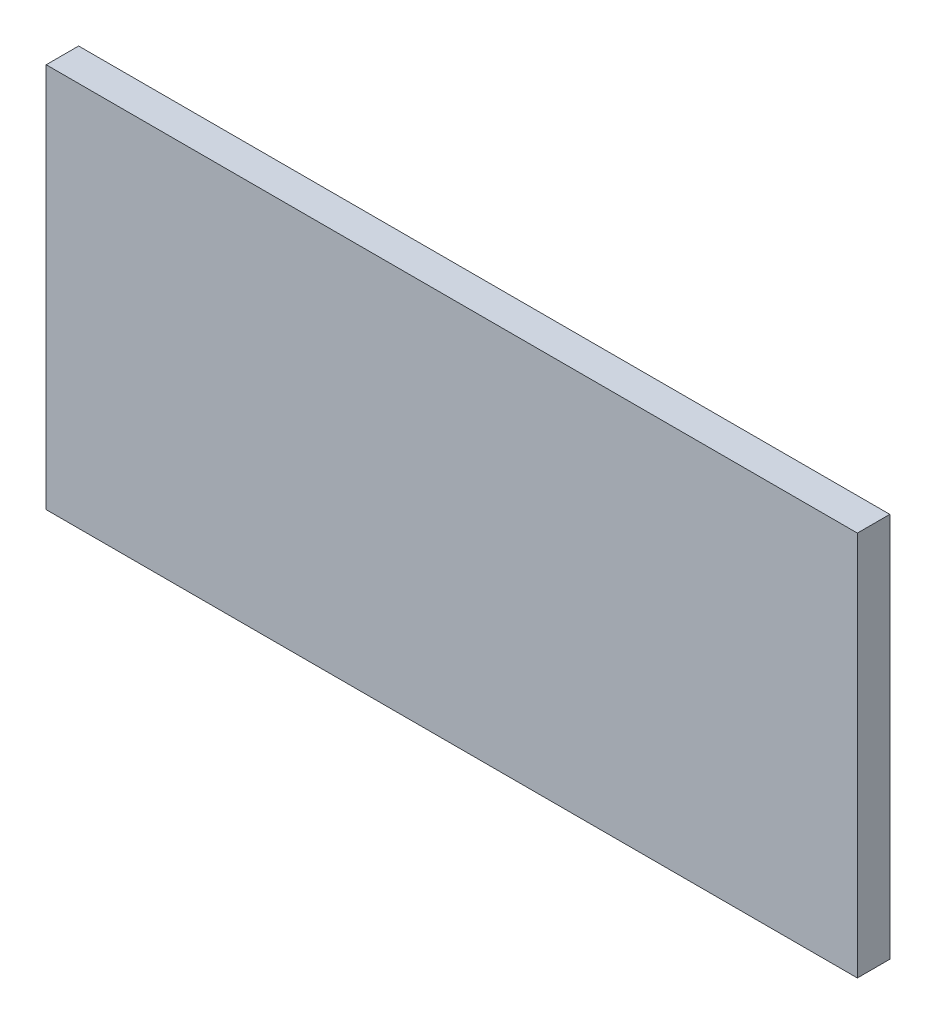
ISO-10303-21;
HEADER;
FILE_DESCRIPTION(('STEP AP214'),'2;1');
FILE_NAME('part.step','',(''),(''),'','','');
FILE_SCHEMA(('AUTOMOTIVE_DESIGN { 1 0 10303 214 1 1 1 1 }'));
ENDSEC;
DATA;
#1=APPLICATION_CONTEXT('core data for automotive mechanical design processes');
#2=APPLICATION_PROTOCOL_DEFINITION('international standard','automotive_design',2000,#1);
#3=PRODUCT_CONTEXT('',#1,'mechanical');
#4=PRODUCT('Part','Part','',(#3));
#5=PRODUCT_RELATED_PRODUCT_CATEGORY('part','',(#4));
#6=PRODUCT_DEFINITION_FORMATION('','',#4);
#7=PRODUCT_DEFINITION_CONTEXT('part definition',#1,'design');
#8=PRODUCT_DEFINITION('design','',#6,#7);
#9=PRODUCT_DEFINITION_SHAPE('','',#8);
#10=(LENGTH_UNIT() NAMED_UNIT(*) SI_UNIT(.MILLI.,.METRE.));
#11=(NAMED_UNIT(*) PLANE_ANGLE_UNIT() SI_UNIT($,.RADIAN.));
#12=(NAMED_UNIT(*) SI_UNIT($,.STERADIAN.) SOLID_ANGLE_UNIT());
#13=UNCERTAINTY_MEASURE_WITH_UNIT(LENGTH_MEASURE(1.E-05),#10,'distance_accuracy_value','');
#14=(GEOMETRIC_REPRESENTATION_CONTEXT(3) GLOBAL_UNCERTAINTY_ASSIGNED_CONTEXT((#13)) GLOBAL_UNIT_ASSIGNED_CONTEXT((#10,
#11,#12)) REPRESENTATION_CONTEXT('',''));
#15=CARTESIAN_POINT('',(0.,0.,0.));
#16=DIRECTION('',(0.,0.,1.));
#17=DIRECTION('',(1.,0.,0.));
#18=AXIS2_PLACEMENT_3D('',#15,#16,#17);
#19=CARTESIAN_POINT('',(0.,19.,1.6));
#20=DIRECTION('',(1.,0.,0.));
#21=DIRECTION('',(0.,0.,-1.));
#22=AXIS2_PLACEMENT_3D('',#19,#20,#21);
#23=PLANE('',#22);
#24=DIRECTION('',(0.,-1.,0.));
#25=VECTOR('',#24,1.);
#26=CARTESIAN_POINT('',(0.,19.,0.));
#27=LINE('',#26,#25);
#28=CARTESIAN_POINT('',(0.,19.,0.));
#29=VERTEX_POINT('',#28);
#30=CARTESIAN_POINT('',(0.,0.,0.));
#31=VERTEX_POINT('',#30);
#32=EDGE_CURVE('E102',#29,#31,#27,.T.);
#33=ORIENTED_EDGE('',*,*,#32,.T.);
#34=DIRECTION('',(0.,0.,-1.));
#35=VECTOR('',#34,1.);
#36=CARTESIAN_POINT('',(0.,0.,1.6));
#37=LINE('',#36,#35);
#38=CARTESIAN_POINT('',(0.,0.,1.6));
#39=VERTEX_POINT('',#38);
#40=EDGE_CURVE('E11',#39,#31,#37,.T.);
#41=ORIENTED_EDGE('',*,*,#40,.F.);
#42=DIRECTION('',(0.,-1.,0.));
#43=VECTOR('',#42,1.);
#44=CARTESIAN_POINT('',(0.,19.,1.6));
#45=LINE('',#44,#43);
#46=CARTESIAN_POINT('',(0.,19.,1.6));
#47=VERTEX_POINT('',#46);
#48=EDGE_CURVE('E90',#47,#39,#45,.T.);
#49=ORIENTED_EDGE('',*,*,#48,.F.);
#50=DIRECTION('',(0.,0.,-1.));
#51=VECTOR('',#50,1.);
#52=CARTESIAN_POINT('',(0.,19.,1.6));
#53=LINE('',#52,#51);
#54=EDGE_CURVE('E98',#47,#29,#53,.T.);
#55=ORIENTED_EDGE('',*,*,#54,.T.);
#56=EDGE_LOOP('',(#33,#41,#49,#55));
#57=FACE_BOUND('',#56,.T.);
#58=ADVANCED_FACE('F39',(#57),#23,.F.);
#59=CARTESIAN_POINT('',(0.,0.,1.6));
#60=DIRECTION('',(0.,1.,0.));
#61=DIRECTION('',(0.,0.,1.));
#62=AXIS2_PLACEMENT_3D('',#59,#60,#61);
#63=PLANE('',#62);
#64=DIRECTION('',(1.,0.,0.));
#65=VECTOR('',#64,1.);
#66=CARTESIAN_POINT('',(0.,0.,0.));
#67=LINE('',#66,#65);
#68=CARTESIAN_POINT('',(40.,0.,0.));
#69=VERTEX_POINT('',#68);
#70=EDGE_CURVE('E94',#31,#69,#67,.T.);
#71=ORIENTED_EDGE('',*,*,#70,.T.);
#72=DIRECTION('',(0.,0.,-1.));
#73=VECTOR('',#72,1.);
#74=CARTESIAN_POINT('',(40.,0.,1.6));
#75=LINE('',#74,#73);
#76=CARTESIAN_POINT('',(40.,0.,1.6));
#77=VERTEX_POINT('',#76);
#78=EDGE_CURVE('E47',#77,#69,#75,.T.);
#79=ORIENTED_EDGE('',*,*,#78,.F.);
#80=DIRECTION('',(1.,0.,0.));
#81=VECTOR('',#80,1.);
#82=CARTESIAN_POINT('',(0.,0.,1.6));
#83=LINE('',#82,#81);
#84=EDGE_CURVE('E85',#39,#77,#83,.T.);
#85=ORIENTED_EDGE('',*,*,#84,.F.);
#86=ORIENTED_EDGE('',*,*,#40,.T.);
#87=EDGE_LOOP('',(#71,#79,#85,#86));
#88=FACE_BOUND('',#87,.T.);
#89=ADVANCED_FACE('F93',(#88),#63,.F.);
#90=CARTESIAN_POINT('',(40.,0.,1.6));
#91=DIRECTION('',(-1.,0.,0.));
#92=DIRECTION('',(0.,0.,1.));
#93=AXIS2_PLACEMENT_3D('',#90,#91,#92);
#94=PLANE('',#93);
#95=DIRECTION('',(0.,1.,0.));
#96=VECTOR('',#95,1.);
#97=CARTESIAN_POINT('',(40.,0.,0.));
#98=LINE('',#97,#96);
#99=CARTESIAN_POINT('',(40.,19.,0.));
#100=VERTEX_POINT('',#99);
#101=EDGE_CURVE('E72',#69,#100,#98,.T.);
#102=ORIENTED_EDGE('',*,*,#101,.T.);
#103=DIRECTION('',(0.,0.,-1.));
#104=VECTOR('',#103,1.);
#105=CARTESIAN_POINT('',(40.,19.,1.6));
#106=LINE('',#105,#104);
#107=CARTESIAN_POINT('',(40.,19.,1.6));
#108=VERTEX_POINT('',#107);
#109=EDGE_CURVE('E95',#108,#100,#106,.T.);
#110=ORIENTED_EDGE('',*,*,#109,.F.);
#111=DIRECTION('',(0.,1.,0.));
#112=VECTOR('',#111,1.);
#113=CARTESIAN_POINT('',(40.,0.,1.6));
#114=LINE('',#113,#112);
#115=EDGE_CURVE('E88',#77,#108,#114,.T.);
#116=ORIENTED_EDGE('',*,*,#115,.F.);
#117=ORIENTED_EDGE('',*,*,#78,.T.);
#118=EDGE_LOOP('',(#102,#110,#116,#117));
#119=FACE_BOUND('',#118,.T.);
#120=ADVANCED_FACE('F96',(#119),#94,.F.);
#121=CARTESIAN_POINT('',(40.,19.,1.6));
#122=DIRECTION('',(0.,-1.,0.));
#123=DIRECTION('',(0.,0.,-1.));
#124=AXIS2_PLACEMENT_3D('',#121,#122,#123);
#125=PLANE('',#124);
#126=DIRECTION('',(-1.,0.,0.));
#127=VECTOR('',#126,1.);
#128=CARTESIAN_POINT('',(40.,19.,0.));
#129=LINE('',#128,#127);
#130=EDGE_CURVE('E78',#100,#29,#129,.T.);
#131=ORIENTED_EDGE('',*,*,#130,.T.);
#132=ORIENTED_EDGE('',*,*,#54,.F.);
#133=DIRECTION('',(-1.,0.,0.));
#134=VECTOR('',#133,1.);
#135=CARTESIAN_POINT('',(40.,19.,1.6));
#136=LINE('',#135,#134);
#137=EDGE_CURVE('E55',#108,#47,#136,.T.);
#138=ORIENTED_EDGE('',*,*,#137,.F.);
#139=ORIENTED_EDGE('',*,*,#109,.T.);
#140=EDGE_LOOP('',(#131,#132,#138,#139));
#141=FACE_BOUND('',#140,.T.);
#142=ADVANCED_FACE('F109',(#141),#125,.F.);
#143=CARTESIAN_POINT('',(0.,0.,1.6));
#144=DIRECTION('',(0.,0.,1.));
#145=DIRECTION('',(1.,0.,0.));
#146=AXIS2_PLACEMENT_3D('',#143,#144,#145);
#147=PLANE('',#146);
#148=ORIENTED_EDGE('',*,*,#48,.T.);
#149=ORIENTED_EDGE('',*,*,#84,.T.);
#150=ORIENTED_EDGE('',*,*,#115,.T.);
#151=ORIENTED_EDGE('',*,*,#137,.T.);
#152=EDGE_LOOP('',(#148,#149,#150,#151));
#153=FACE_BOUND('',#152,.T.);
#154=ADVANCED_FACE('F86',(#153),#147,.T.);
#155=CARTESIAN_POINT('',(0.,0.,0.));
#156=DIRECTION('',(0.,0.,1.));
#157=DIRECTION('',(1.,0.,0.));
#158=AXIS2_PLACEMENT_3D('',#155,#156,#157);
#159=PLANE('',#158);
#160=ORIENTED_EDGE('',*,*,#32,.F.);
#161=ORIENTED_EDGE('',*,*,#130,.F.);
#162=ORIENTED_EDGE('',*,*,#101,.F.);
#163=ORIENTED_EDGE('',*,*,#70,.F.);
#164=EDGE_LOOP('',(#160,#161,#162,#163));
#165=FACE_BOUND('',#164,.T.);
#166=ADVANCED_FACE('F112',(#165),#159,.F.);
#167=CLOSED_SHELL('',(#58,#89,#120,#142,#154,#166));
#168=MANIFOLD_SOLID_BREP('B2',#167);
#169=ADVANCED_BREP_SHAPE_REPRESENTATION('',(#18,#168),#14);
#170=SHAPE_DEFINITION_REPRESENTATION(#9,#169);
ENDSEC;
END-ISO-10303-21;
